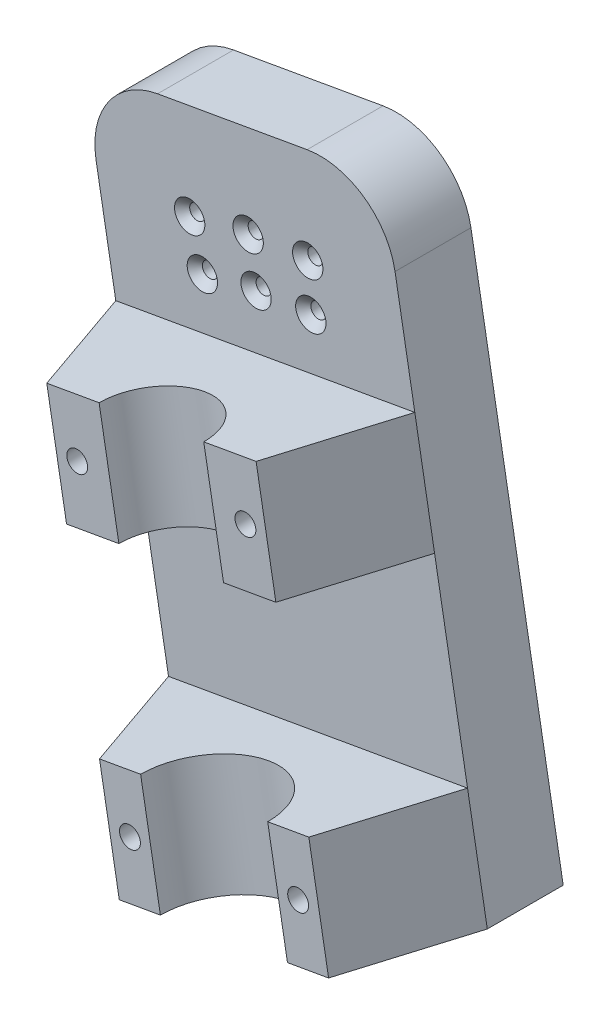
ISO-10303-21;
HEADER;
FILE_DESCRIPTION(('STEP AP214'),'2;1');
FILE_NAME('part.step','',(''),(''),'','','');
FILE_SCHEMA(('AUTOMOTIVE_DESIGN { 1 0 10303 214 1 1 1 1 }'));
ENDSEC;
DATA;
#1=APPLICATION_CONTEXT('core data for automotive mechanical design processes');
#2=APPLICATION_PROTOCOL_DEFINITION('international standard','automotive_design',2000,#1);
#3=PRODUCT_CONTEXT('',#1,'mechanical');
#4=PRODUCT('Part','Part','',(#3));
#5=PRODUCT_RELATED_PRODUCT_CATEGORY('part','',(#4));
#6=PRODUCT_DEFINITION_FORMATION('','',#4);
#7=PRODUCT_DEFINITION_CONTEXT('part definition',#1,'design');
#8=PRODUCT_DEFINITION('design','',#6,#7);
#9=PRODUCT_DEFINITION_SHAPE('','',#8);
#10=(LENGTH_UNIT() NAMED_UNIT(*) SI_UNIT(.MILLI.,.METRE.));
#11=(NAMED_UNIT(*) PLANE_ANGLE_UNIT() SI_UNIT($,.RADIAN.));
#12=(NAMED_UNIT(*) SI_UNIT($,.STERADIAN.) SOLID_ANGLE_UNIT());
#13=UNCERTAINTY_MEASURE_WITH_UNIT(LENGTH_MEASURE(1.E-05),#10,'distance_accuracy_value','');
#14=(GEOMETRIC_REPRESENTATION_CONTEXT(3) GLOBAL_UNCERTAINTY_ASSIGNED_CONTEXT((#13)) GLOBAL_UNIT_ASSIGNED_CONTEXT((#10,
#11,#12)) REPRESENTATION_CONTEXT('',''));
#15=CARTESIAN_POINT('',(0.,0.,0.));
#16=DIRECTION('',(0.,0.,1.));
#17=DIRECTION('',(1.,0.,0.));
#18=AXIS2_PLACEMENT_3D('',#15,#16,#17);
#19=CARTESIAN_POINT('',(-10.5925388376752,60.073272933746,40.));
#20=DIRECTION('',(-0.173648177666807,0.98480775301223,0.));
#21=DIRECTION('',(-0.98480775301223,-0.173648177666807,0.));
#22=AXIS2_PLACEMENT_3D('',#19,#20,#21);
#23=PLANE('',#22);
#24=DIRECTION('',(0.365748417469977,0.064491314151333,0.928476690885259));
#25=VECTOR('',#24,1.);
#26=CARTESIAN_POINT('',(-17.3843164446646,58.8756992946631,42.7586206896586));
#27=LINE('',#26,#25);
#28=CARTESIAN_POINT('',(-30.2886938979296,56.6003093804081,10.));
#29=VERTEX_POINT('',#28);
#30=CARTESIAN_POINT('',(-24.3798473798555,57.6421984464089,25.));
#31=VERTEX_POINT('',#30);
#32=EDGE_CURVE('E461',#29,#31,#27,.T.);
#33=ORIENTED_EDGE('',*,*,#32,.T.);
#34=DIRECTION('',(0.984807753012227,0.173648177666823,0.));
#35=VECTOR('',#34,1.);
#36=CARTESIAN_POINT('',(-10.5925388376762,60.0732729337458,25.));
#37=LINE('',#36,#35);
#38=CARTESIAN_POINT('',(-17.4861931087608,58.8577356900783,25.));
#39=VERTEX_POINT('',#38);
#40=EDGE_CURVE('E513',#31,#39,#37,.T.);
#41=ORIENTED_EDGE('',*,*,#40,.T.);
#42=CARTESIAN_POINT('',(-10.5925388376752,60.073272933746,25.));
#43=DIRECTION('',(-0.173648177666823,0.984807753012227,0.));
#44=DIRECTION('',(-0.984807753012227,-0.173648177666823,0.));
#45=AXIS2_PLACEMENT_3D('',#42,#43,#44);
#46=CIRCLE('',#45,7.);
#47=CARTESIAN_POINT('',(-3.69888456658963,61.2888101774138,25.));
#48=VERTEX_POINT('',#47);
#49=EDGE_CURVE('E182',#48,#39,#46,.T.);
#50=ORIENTED_EDGE('',*,*,#49,.F.);
#51=DIRECTION('',(0.984807753012227,0.173648177666823,0.));
#52=VECTOR('',#51,1.);
#53=CARTESIAN_POINT('',(-10.5925388376762,60.0732729337458,25.));
#54=LINE('',#53,#52);
#55=CARTESIAN_POINT('',(3.1947697045051,62.5043474210832,25.));
#56=VERTEX_POINT('',#55);
#57=EDGE_CURVE('E164',#48,#56,#54,.T.);
#58=ORIENTED_EDGE('',*,*,#57,.T.);
#59=DIRECTION('',(-0.365748417469,-0.0644913141511606,0.928476690885656));
#60=VECTOR('',#59,1.);
#61=CARTESIAN_POINT('',(-3.8007612306654,61.2708465728325,42.7586206896584));
#62=LINE('',#61,#60);
#63=CARTESIAN_POINT('',(9.10361622255956,63.5462364870804,10.));
#64=VERTEX_POINT('',#63);
#65=EDGE_CURVE('E178',#64,#56,#62,.T.);
#66=ORIENTED_EDGE('',*,*,#65,.F.);
#67=DIRECTION('',(0.98480775301223,0.173648177666807,0.));
#68=VECTOR('',#67,1.);
#69=CARTESIAN_POINT('',(-10.5925388376752,60.073272933746,10.));
#70=LINE('',#69,#68);
#71=EDGE_CURVE('E201',#29,#64,#70,.T.);
#72=ORIENTED_EDGE('',*,*,#71,.F.);
#73=EDGE_LOOP('',(#33,#41,#50,#58,#66,#72));
#74=FACE_BOUND('',#73,.T.);
#75=ADVANCED_FACE('F39',(#74),#23,.T.);
#76=CARTESIAN_POINT('',(-7.98781617267313,45.3011566385626,40.));
#77=DIRECTION('',(-0.173648177666807,0.98480775301223,0.));
#78=DIRECTION('',(-0.98480775301223,-0.173648177666807,0.));
#79=AXIS2_PLACEMENT_3D('',#76,#77,#78);
#80=PLANE('',#79);
#81=DIRECTION('',(0.98480775301223,0.173648177666807,0.));
#82=VECTOR('',#81,1.);
#83=CARTESIAN_POINT('',(-7.98781617267313,45.3011566385626,25.));
#84=LINE('',#83,#82);
#85=CARTESIAN_POINT('',(-21.7751247148532,42.8700821512257,25.));
#86=VERTEX_POINT('',#85);
#87=CARTESIAN_POINT('',(-14.8814704437585,44.0856193948949,25.));
#88=VERTEX_POINT('',#87);
#89=EDGE_CURVE('E467',#86,#88,#84,.T.);
#90=ORIENTED_EDGE('',*,*,#89,.F.);
#91=DIRECTION('',(0.365748417469977,0.0644913141513331,0.92847669088526));
#92=VECTOR('',#91,1.);
#93=CARTESIAN_POINT('',(-14.7795937796623,44.1035829994797,42.7586206896585));
#94=LINE('',#93,#92);
#95=CARTESIAN_POINT('',(-27.6839712329273,41.8281930852247,10.));
#96=VERTEX_POINT('',#95);
#97=EDGE_CURVE('E460',#96,#86,#94,.T.);
#98=ORIENTED_EDGE('',*,*,#97,.F.);
#99=DIRECTION('',(0.98480775301223,0.173648177666807,0.));
#100=VECTOR('',#99,1.);
#101=CARTESIAN_POINT('',(-7.98781617267313,45.3011566385626,10.));
#102=LINE('',#101,#100);
#103=CARTESIAN_POINT('',(11.7083388875619,48.774120191897,10.));
#104=VERTEX_POINT('',#103);
#105=EDGE_CURVE('E203',#96,#104,#102,.T.);
#106=ORIENTED_EDGE('',*,*,#105,.T.);
#107=DIRECTION('',(-0.365748417469,-0.0644913141511607,0.928476690885656));
#108=VECTOR('',#107,1.);
#109=CARTESIAN_POINT('',(-1.19603856566308,46.4987302776491,42.7586206896585));
#110=LINE('',#109,#108);
#111=CARTESIAN_POINT('',(5.79949236950684,47.7322311258994,25.));
#112=VERTEX_POINT('',#111);
#113=EDGE_CURVE('E190',#104,#112,#110,.T.);
#114=ORIENTED_EDGE('',*,*,#113,.T.);
#115=DIRECTION('',(0.98480775301223,0.173648177666807,0.));
#116=VECTOR('',#115,1.);
#117=CARTESIAN_POINT('',(-7.98781617267313,45.3011566385626,25.));
#118=LINE('',#117,#116);
#119=CARTESIAN_POINT('',(-1.09416190158726,46.5166938822302,25.));
#120=VERTEX_POINT('',#119);
#121=EDGE_CURVE('E167',#120,#112,#118,.T.);
#122=ORIENTED_EDGE('',*,*,#121,.F.);
#123=CARTESIAN_POINT('',(-7.98781617267287,45.3011566385626,25.));
#124=DIRECTION('',(-0.173648177666807,0.98480775301223,0.));
#125=DIRECTION('',(-0.98480775301223,-0.173648177666807,0.));
#126=AXIS2_PLACEMENT_3D('',#123,#124,#125);
#127=CIRCLE('',#126,7.);
#128=EDGE_CURVE('E291',#120,#88,#127,.T.);
#129=ORIENTED_EDGE('',*,*,#128,.T.);
#130=EDGE_LOOP('',(#90,#98,#106,#114,#122,#129));
#131=FACE_BOUND('',#130,.T.);
#132=ADVANCED_FACE('F338',(#131),#80,.F.);
#133=CARTESIAN_POINT('',(-20.7380441262546,2.4358829647356,10.));
#134=DIRECTION('',(-0.173648177666807,0.98480775301223,0.));
#135=DIRECTION('',(-0.98480775301223,-0.173648177666807,0.));
#136=AXIS2_PLACEMENT_3D('',#133,#134,#135);
#137=PLANE('',#136);
#138=DIRECTION('',(0.98480775301223,0.173648177666807,0.));
#139=VECTOR('',#138,1.);
#140=CARTESIAN_POINT('',(-20.7380441262546,2.4358829647356,25.));
#141=LINE('',#140,#139);
#142=CARTESIAN_POINT('',(7.32897683460336,7.38485602824126,25.));
#143=VERTEX_POINT('',#142);
#144=CARTESIAN_POINT('',(12.7454194761798,8.33992100541031,25.));
#145=VERTEX_POINT('',#144);
#146=EDGE_CURVE('E494',#143,#145,#141,.T.);
#147=ORIENTED_EDGE('',*,*,#146,.F.);
#148=CARTESIAN_POINT('',(-1.04188906600059,5.9088465180734,25.));
#149=DIRECTION('',(-0.173648177666807,0.98480775301223,0.));
#150=DIRECTION('',(-0.98480775301223,-0.173648177666807,0.));
#151=AXIS2_PLACEMENT_3D('',#148,#149,#150);
#152=CIRCLE('',#151,8.5);
#153=CARTESIAN_POINT('',(-9.41275496660455,4.43283700790554,25.));
#154=VERTEX_POINT('',#153);
#155=EDGE_CURVE('E491',#143,#154,#152,.T.);
#156=ORIENTED_EDGE('',*,*,#155,.T.);
#157=DIRECTION('',(-0.98480775301223,-0.173648177666807,0.));
#158=VECTOR('',#157,1.);
#159=CARTESIAN_POINT('',(-20.7380441262546,2.4358829647356,25.));
#160=LINE('',#159,#158);
#161=CARTESIAN_POINT('',(-14.8291976081809,3.47777203073643,25.));
#162=VERTEX_POINT('',#161);
#163=EDGE_CURVE('E490',#154,#162,#160,.T.);
#164=ORIENTED_EDGE('',*,*,#163,.T.);
#165=DIRECTION('',(0.365748417469977,0.064491314151333,0.92847669088526));
#166=VECTOR('',#165,1.);
#167=CARTESIAN_POINT('',(-20.7380441262546,2.4358829647356,10.));
#168=LINE('',#167,#166);
#169=CARTESIAN_POINT('',(-20.7380441262544,2.43588296473565,10.));
#170=VERTEX_POINT('',#169);
#171=EDGE_CURVE('E195',#170,#162,#168,.T.);
#172=ORIENTED_EDGE('',*,*,#171,.F.);
#173=DIRECTION('',(0.,0.,-1.));
#174=VECTOR('',#173,1.);
#175=CARTESIAN_POINT('',(-20.7380441262546,2.4358829647356,10.));
#176=LINE('',#175,#174);
#177=CARTESIAN_POINT('',(-20.7380441262546,2.4358829647356,0.));
#178=VERTEX_POINT('',#177);
#179=EDGE_CURVE('E244',#170,#178,#176,.T.);
#180=ORIENTED_EDGE('',*,*,#179,.T.);
#181=DIRECTION('',(0.98480775301223,0.173648177666807,0.));
#182=VECTOR('',#181,1.);
#183=CARTESIAN_POINT('',(-20.7380441262546,2.4358829647356,0.));
#184=LINE('',#183,#182);
#185=CARTESIAN_POINT('',(18.6542659942346,9.38181007140788,0.));
#186=VERTEX_POINT('',#185);
#187=EDGE_CURVE('E240',#178,#186,#184,.T.);
#188=ORIENTED_EDGE('',*,*,#187,.T.);
#189=DIRECTION('',(0.,0.,-1.));
#190=VECTOR('',#189,1.);
#191=CARTESIAN_POINT('',(18.6542659942346,9.38181007140788,10.));
#192=LINE('',#191,#190);
#193=CARTESIAN_POINT('',(18.6542659942348,9.38181007140792,10.));
#194=VERTEX_POINT('',#193);
#195=EDGE_CURVE('E235',#194,#186,#192,.T.);
#196=ORIENTED_EDGE('',*,*,#195,.F.);
#197=DIRECTION('',(-0.365748417469,-0.0644913141511606,0.928476690885656));
#198=VECTOR('',#197,1.);
#199=CARTESIAN_POINT('',(13.2208439086791,8.42375116014789,23.793103448245));
#200=LINE('',#199,#198);
#201=EDGE_CURVE('E189',#194,#145,#200,.T.);
#202=ORIENTED_EDGE('',*,*,#201,.T.);
#203=EDGE_LOOP('',(#147,#156,#164,#172,#180,#188,#196,#202));
#204=FACE_BOUND('',#203,.T.);
#205=ADVANCED_FACE('F322',(#204),#137,.F.);
#206=CARTESIAN_POINT('',(-3.64661173100294,20.6809628132568,40.));
#207=DIRECTION('',(-0.173648177666807,0.98480775301223,0.));
#208=DIRECTION('',(-0.98480775301223,-0.173648177666807,0.));
#209=AXIS2_PLACEMENT_3D('',#206,#207,#208);
#210=PLANE('',#209);
#211=CARTESIAN_POINT('',(-3.64661173100294,20.6809628132568,25.));
#212=DIRECTION('',(-0.173648177666823,0.984807753012227,0.));
#213=DIRECTION('',(-0.984807753012227,-0.173648177666823,0.));
#214=AXIS2_PLACEMENT_3D('',#211,#212,#213);
#215=CIRCLE('',#214,8.5);
#216=CARTESIAN_POINT('',(4.72425416960098,22.1569723234248,25.));
#217=VERTEX_POINT('',#216);
#218=CARTESIAN_POINT('',(-12.0174776316069,19.2049533030888,25.));
#219=VERTEX_POINT('',#218);
#220=EDGE_CURVE('E505',#217,#219,#215,.T.);
#221=ORIENTED_EDGE('',*,*,#220,.F.);
#222=DIRECTION('',(0.984807753012227,0.173648177666823,0.));
#223=VECTOR('',#222,1.);
#224=CARTESIAN_POINT('',(-3.64661173100329,20.6809628132568,25.));
#225=LINE('',#224,#223);
#226=CARTESIAN_POINT('',(10.1406968111774,23.112037300594,25.));
#227=VERTEX_POINT('',#226);
#228=EDGE_CURVE('E481',#217,#227,#225,.T.);
#229=ORIENTED_EDGE('',*,*,#228,.T.);
#230=DIRECTION('',(-0.365748417469,-0.0644913141511606,0.928476690885656));
#231=VECTOR('',#230,1.);
#232=CARTESIAN_POINT('',(3.14516587600745,21.8785364523434,42.7586206896586));
#233=LINE('',#232,#231);
#234=CARTESIAN_POINT('',(16.0495433292325,24.1539263665913,10.));
#235=VERTEX_POINT('',#234);
#236=EDGE_CURVE('E288',#235,#227,#233,.T.);
#237=ORIENTED_EDGE('',*,*,#236,.F.);
#238=DIRECTION('',(0.98480775301223,0.173648177666807,0.));
#239=VECTOR('',#238,1.);
#240=CARTESIAN_POINT('',(-3.64661173100294,20.6809628132568,10.));
#241=LINE('',#240,#239);
#242=CARTESIAN_POINT('',(-23.3427667912567,17.2079992599191,10.));
#243=VERTEX_POINT('',#242);
#244=EDGE_CURVE('E193',#243,#235,#241,.T.);
#245=ORIENTED_EDGE('',*,*,#244,.F.);
#246=DIRECTION('',(0.365748417469977,0.064491314151333,0.928476690885259));
#247=VECTOR('',#246,1.);
#248=CARTESIAN_POINT('',(-10.4383893379917,19.483389174174,42.7586206896584));
#249=LINE('',#248,#247);
#250=CARTESIAN_POINT('',(-17.4339202731833,18.2498883259197,25.));
#251=VERTEX_POINT('',#250);
#252=EDGE_CURVE('E285',#243,#251,#249,.T.);
#253=ORIENTED_EDGE('',*,*,#252,.T.);
#254=DIRECTION('',(-0.984807753012227,-0.173648177666823,0.));
#255=VECTOR('',#254,1.);
#256=CARTESIAN_POINT('',(-3.64661173100329,20.6809628132568,25.));
#257=LINE('',#256,#255);
#258=EDGE_CURVE('E503',#219,#251,#257,.T.);
#259=ORIENTED_EDGE('',*,*,#258,.F.);
#260=EDGE_LOOP('',(#221,#229,#237,#245,#253,#259));
#261=FACE_BOUND('',#260,.T.);
#262=ADVANCED_FACE('F381',(#261),#210,.T.);
#263=CARTESIAN_POINT('',(-34.6298983395991,81.220503205714,10.));
#264=DIRECTION('',(0.98480775301223,0.173648177666807,0.));
#265=DIRECTION('',(-0.173648177666807,0.98480775301223,0.));
#266=AXIS2_PLACEMENT_3D('',#263,#264,#265);
#267=PLANE('',#266);
#268=DIRECTION('',(0.173648177666807,-0.98480775301223,0.));
#269=VECTOR('',#268,1.);
#270=CARTESIAN_POINT('',(-34.6298983395991,81.220503205714,10.));
#271=LINE('',#270,#269);
#272=CARTESIAN_POINT('',(-32.8934165629311,71.3724256755917,10.));
#273=VERTEX_POINT('',#272);
#274=EDGE_CURVE('E233',#273,#29,#271,.T.);
#275=ORIENTED_EDGE('',*,*,#274,.F.);
#276=DIRECTION('',(0.,0.,-1.));
#277=VECTOR('',#276,1.);
#278=CARTESIAN_POINT('',(-32.8934165629311,71.3724256755917,0.));
#279=LINE('',#278,#277);
#280=CARTESIAN_POINT('',(-32.8934165629311,71.3724256755917,0.));
#281=VERTEX_POINT('',#280);
#282=EDGE_CURVE('E11',#273,#281,#279,.T.);
#283=ORIENTED_EDGE('',*,*,#282,.T.);
#284=DIRECTION('',(0.173648177666807,-0.98480775301223,0.));
#285=VECTOR('',#284,1.);
#286=CARTESIAN_POINT('',(-34.6298983395991,81.220503205714,0.));
#287=LINE('',#286,#285);
#288=EDGE_CURVE('E229',#281,#178,#287,.T.);
#289=ORIENTED_EDGE('',*,*,#288,.T.);
#290=ORIENTED_EDGE('',*,*,#179,.F.);
#291=DIRECTION('',(-0.173648177666823,0.984807753012227,0.));
#292=VECTOR('',#291,1.);
#293=CARTESIAN_POINT('',(-16.5704878622505,-21.1995031075581,10.));
#294=LINE('',#293,#292);
#295=EDGE_CURVE('E463',#170,#243,#294,.T.);
#296=ORIENTED_EDGE('',*,*,#295,.T.);
#297=EDGE_CURVE('E232',#96,#243,#271,.T.);
#298=ORIENTED_EDGE('',*,*,#297,.F.);
#299=EDGE_CURVE('E457',#96,#29,#294,.T.);
#300=ORIENTED_EDGE('',*,*,#299,.T.);
#301=EDGE_LOOP('',(#275,#283,#289,#290,#296,#298,#300));
#302=FACE_BOUND('',#301,.T.);
#303=ADVANCED_FACE('F327',(#302),#267,.F.);
#304=CARTESIAN_POINT('',(0.,0.,10.));
#305=DIRECTION('',(0.,0.,-1.));
#306=DIRECTION('',(-1.,0.,0.));
#307=AXIS2_PLACEMENT_3D('',#304,#305,#306);
#308=PLANE('',#307);
#309=ORIENTED_EDGE('',*,*,#297,.T.);
#310=ORIENTED_EDGE('',*,*,#244,.T.);
#311=DIRECTION('',(0.173648177666807,-0.98480775301223,0.));
#312=VECTOR('',#311,1.);
#313=CARTESIAN_POINT('',(4.76241178089006,88.1664303123863,10.));
#314=LINE('',#313,#312);
#315=EDGE_CURVE('E228',#104,#235,#314,.T.);
#316=ORIENTED_EDGE('',*,*,#315,.F.);
#317=ORIENTED_EDGE('',*,*,#105,.F.);
#318=EDGE_LOOP('',(#309,#310,#316,#317));
#319=FACE_BOUND('',#318,.T.);
#320=ADVANCED_FACE('F375',(#319),#308,.F.);
#321=CARTESIAN_POINT('',(-34.6298983395991,81.220503205714,10.));
#322=DIRECTION('',(-0.173648177666807,0.98480775301223,0.));
#323=DIRECTION('',(-0.98480775301223,-0.173648177666807,0.));
#324=AXIS2_PLACEMENT_3D('',#321,#322,#323);
#325=PLANE('',#324);
#326=DIRECTION('',(0.98480775301223,0.173648177666807,0.));
#327=VECTOR('',#326,1.);
#328=CARTESIAN_POINT('',(-34.6298983395991,81.220503205714,10.));
#329=LINE('',#328,#327);
#330=CARTESIAN_POINT('',(-24.7818208094768,82.9569849823821,10.));
#331=VERTEX_POINT('',#330);
#332=CARTESIAN_POINT('',(-5.08566574923224,86.4299485357182,10.));
#333=VERTEX_POINT('',#332);
#334=EDGE_CURVE('E225',#331,#333,#329,.T.);
#335=ORIENTED_EDGE('',*,*,#334,.T.);
#336=DIRECTION('',(0.,0.,-1.));
#337=VECTOR('',#336,1.);
#338=CARTESIAN_POINT('',(-5.08566574923224,86.4299485357182,10.));
#339=LINE('',#338,#337);
#340=CARTESIAN_POINT('',(-5.08566574923224,86.4299485357182,0.));
#341=VERTEX_POINT('',#340);
#342=EDGE_CURVE('E296',#333,#341,#339,.T.);
#343=ORIENTED_EDGE('',*,*,#342,.T.);
#344=DIRECTION('',(0.98480775301223,0.173648177666807,0.));
#345=VECTOR('',#344,1.);
#346=CARTESIAN_POINT('',(-34.6298983395991,81.220503205714,0.));
#347=LINE('',#346,#345);
#348=CARTESIAN_POINT('',(-24.7818208094768,82.9569849823821,0.));
#349=VERTEX_POINT('',#348);
#350=EDGE_CURVE('E224',#349,#341,#347,.T.);
#351=ORIENTED_EDGE('',*,*,#350,.F.);
#352=DIRECTION('',(0.,0.,-1.));
#353=VECTOR('',#352,1.);
#354=CARTESIAN_POINT('',(-24.7818208094768,82.9569849823821,10.));
#355=LINE('',#354,#353);
#356=EDGE_CURVE('E294',#349,#331,#355,.F.);
#357=ORIENTED_EDGE('',*,*,#356,.T.);
#358=EDGE_LOOP('',(#335,#343,#351,#357));
#359=FACE_BOUND('',#358,.T.);
#360=ADVANCED_FACE('F309',(#359),#325,.T.);
#361=CARTESIAN_POINT('',(4.76241178089006,88.1664303123863,10.));
#362=DIRECTION('',(0.98480775301223,0.173648177666807,0.));
#363=DIRECTION('',(-0.173648177666807,0.98480775301223,0.));
#364=AXIS2_PLACEMENT_3D('',#361,#362,#363);
#365=PLANE('',#364);
#366=DIRECTION('',(0.173648177666807,-0.98480775301223,0.));
#367=VECTOR('',#366,1.);
#368=CARTESIAN_POINT('',(4.76241178089006,88.1664303123863,0.));
#369=LINE('',#368,#367);
#370=CARTESIAN_POINT('',(6.49889355755812,78.318352782264,0.));
#371=VERTEX_POINT('',#370);
#372=EDGE_CURVE('E238',#371,#186,#369,.T.);
#373=ORIENTED_EDGE('',*,*,#372,.F.);
#374=DIRECTION('',(0.,0.,-1.));
#375=VECTOR('',#374,1.);
#376=CARTESIAN_POINT('',(6.49889355755812,78.318352782264,10.));
#377=LINE('',#376,#375);
#378=CARTESIAN_POINT('',(6.49889355755812,78.318352782264,10.));
#379=VERTEX_POINT('',#378);
#380=EDGE_CURVE('E62',#371,#379,#377,.F.);
#381=ORIENTED_EDGE('',*,*,#380,.T.);
#382=EDGE_CURVE('E230',#379,#64,#314,.T.);
#383=ORIENTED_EDGE('',*,*,#382,.T.);
#384=DIRECTION('',(0.173648177666823,-0.984807753012227,0.));
#385=VECTOR('',#384,1.);
#386=CARTESIAN_POINT('',(8.75631986722586,65.5158519931052,10.));
#387=LINE('',#386,#385);
#388=EDGE_CURVE('E188',#64,#104,#387,.T.);
#389=ORIENTED_EDGE('',*,*,#388,.T.);
#390=ORIENTED_EDGE('',*,*,#315,.T.);
#391=EDGE_CURVE('E171',#235,#194,#387,.T.);
#392=ORIENTED_EDGE('',*,*,#391,.T.);
#393=ORIENTED_EDGE('',*,*,#195,.T.);
#394=EDGE_LOOP('',(#373,#381,#383,#389,#390,#392,#393));
#395=FACE_BOUND('',#394,.T.);
#396=ADVANCED_FACE('F316',(#395),#365,.T.);
#397=CARTESIAN_POINT('',(-11.8080760813513,66.9669272048301,10.));
#398=DIRECTION('',(0.,0.,-1.));
#399=DIRECTION('',(-1.,0.,0.));
#400=AXIS2_PLACEMENT_3D('',#397,#398,#399);
#401=CIRCLE('',#400,2.);
#402=CARTESIAN_POINT('',(-13.8080760813513,66.9669272048301,10.));
#403=VERTEX_POINT('',#402);
#404=EDGE_CURVE('E267',#403,#403,#401,.T.);
#405=ORIENTED_EDGE('',*,*,#404,.T.);
#406=EDGE_LOOP('',(#405));
#407=FACE_BOUND('',#406,.T.);
#408=CARTESIAN_POINT('',(-12.8499651473529,72.8757737229034,10.));
#409=DIRECTION('',(0.,0.,-1.));
#410=DIRECTION('',(-1.,0.,0.));
#411=AXIS2_PLACEMENT_3D('',#408,#409,#410);
#412=CIRCLE('',#411,2.);
#413=CARTESIAN_POINT('',(-14.8499651473529,72.8757737229034,10.));
#414=VERTEX_POINT('',#413);
#415=EDGE_CURVE('E264',#414,#414,#412,.T.);
#416=ORIENTED_EDGE('',*,*,#415,.T.);
#417=EDGE_LOOP('',(#416));
#418=FACE_BOUND('',#417,.T.);
#419=CARTESIAN_POINT('',(-18.8867130572049,65.32451354503,10.));
#420=DIRECTION('',(0.,0.,-1.));
#421=DIRECTION('',(-1.,0.,0.));
#422=AXIS2_PLACEMENT_3D('',#419,#420,#421);
#423=CIRCLE('',#422,2.);
#424=CARTESIAN_POINT('',(-20.8867130572049,65.32451354503,10.));
#425=VERTEX_POINT('',#424);
#426=EDGE_CURVE('E261',#425,#425,#423,.T.);
#427=ORIENTED_EDGE('',*,*,#426,.T.);
#428=EDGE_LOOP('',(#427));
#429=FACE_BOUND('',#428,.T.);
#430=CARTESIAN_POINT('',(-4.5945945945946,67.8445996414698,10.));
#431=DIRECTION('',(0.,0.,-1.));
#432=DIRECTION('',(-1.,0.,0.));
#433=AXIS2_PLACEMENT_3D('',#430,#431,#432);
#434=CIRCLE('',#433,2.);
#435=CARTESIAN_POINT('',(-6.59459459459461,67.8445996414698,10.));
#436=VERTEX_POINT('',#435);
#437=EDGE_CURVE('E258',#436,#436,#434,.T.);
#438=ORIENTED_EDGE('',*,*,#437,.T.);
#439=EDGE_LOOP('',(#438));
#440=FACE_BOUND('',#439,.T.);
#441=CARTESIAN_POINT('',(-5.,73.8308878451289,10.));
#442=DIRECTION('',(0.,0.,-1.));
#443=DIRECTION('',(-1.,0.,0.));
#444=AXIS2_PLACEMENT_3D('',#441,#442,#443);
#445=CIRCLE('',#444,2.);
#446=CARTESIAN_POINT('',(-7.,73.8308878451289,10.));
#447=VERTEX_POINT('',#446);
#448=EDGE_CURVE('E255',#447,#447,#445,.T.);
#449=ORIENTED_EDGE('',*,*,#448,.T.);
#450=EDGE_LOOP('',(#449));
#451=FACE_BOUND('',#450,.T.);
#452=CARTESIAN_POINT('',(-20.5531877387229,71.0884412107679,10.));
#453=DIRECTION('',(0.,0.,-1.));
#454=DIRECTION('',(-1.,0.,0.));
#455=AXIS2_PLACEMENT_3D('',#452,#453,#454);
#456=CIRCLE('',#455,2.);
#457=CARTESIAN_POINT('',(-22.5531877387229,71.0884412107679,10.));
#458=VERTEX_POINT('',#457);
#459=EDGE_CURVE('E252',#458,#458,#456,.T.);
#460=ORIENTED_EDGE('',*,*,#459,.T.);
#461=EDGE_LOOP('',(#460));
#462=FACE_BOUND('',#461,.T.);
#463=ORIENTED_EDGE('',*,*,#382,.F.);
#464=CARTESIAN_POINT('',(-3.34918397256417,76.5818710055959,10.));
#465=DIRECTION('',(0.,0.,-1.));
#466=DIRECTION('',(-1.,0.,0.));
#467=AXIS2_PLACEMENT_3D('',#464,#465,#466);
#468=CIRCLE('',#467,10.);
#469=EDGE_CURVE('E47',#379,#333,#468,.F.);
#470=ORIENTED_EDGE('',*,*,#469,.T.);
#471=ORIENTED_EDGE('',*,*,#334,.F.);
#472=CARTESIAN_POINT('',(-23.0453390328088,73.1089074522598,10.));
#473=DIRECTION('',(0.,0.,-1.));
#474=DIRECTION('',(-1.,0.,0.));
#475=AXIS2_PLACEMENT_3D('',#472,#473,#474);
#476=CIRCLE('',#475,10.);
#477=EDGE_CURVE('E54',#331,#273,#476,.F.);
#478=ORIENTED_EDGE('',*,*,#477,.T.);
#479=ORIENTED_EDGE('',*,*,#274,.T.);
#480=ORIENTED_EDGE('',*,*,#71,.T.);
#481=EDGE_LOOP('',(#463,#470,#471,#478,#479,#480));
#482=FACE_BOUND('',#481,.T.);
#483=ADVANCED_FACE('F305',(#407,#418,#429,#440,#451,#462,#482),#308,.F.);
#484=CARTESIAN_POINT('',(0.,0.,0.));
#485=DIRECTION('',(0.,0.,-1.));
#486=DIRECTION('',(-1.,0.,0.));
#487=AXIS2_PLACEMENT_3D('',#484,#485,#486);
#488=PLANE('',#487);
#489=CARTESIAN_POINT('',(-5.,73.8308878451289,0.));
#490=DIRECTION('',(0.,0.,1.));
#491=DIRECTION('',(1.,0.,0.));
#492=AXIS2_PLACEMENT_3D('',#489,#490,#491);
#493=CIRCLE('',#492,1.);
#494=CARTESIAN_POINT('',(-4.,73.8308878451289,0.));
#495=VERTEX_POINT('',#494);
#496=EDGE_CURVE('E210',#495,#495,#493,.T.);
#497=ORIENTED_EDGE('',*,*,#496,.T.);
#498=EDGE_LOOP('',(#497));
#499=FACE_BOUND('',#498,.T.);
#500=CARTESIAN_POINT('',(-4.5945945945946,67.8445996414698,0.));
#501=DIRECTION('',(0.,0.,1.));
#502=DIRECTION('',(1.,0.,0.));
#503=AXIS2_PLACEMENT_3D('',#500,#501,#502);
#504=CIRCLE('',#503,1.);
#505=CARTESIAN_POINT('',(-3.5945945945946,67.8445996414698,0.));
#506=VERTEX_POINT('',#505);
#507=EDGE_CURVE('E214',#506,#506,#504,.T.);
#508=ORIENTED_EDGE('',*,*,#507,.T.);
#509=EDGE_LOOP('',(#508));
#510=FACE_BOUND('',#509,.T.);
#511=CARTESIAN_POINT('',(-18.8867130572049,65.32451354503,0.));
#512=DIRECTION('',(0.,0.,1.));
#513=DIRECTION('',(1.,0.,0.));
#514=AXIS2_PLACEMENT_3D('',#511,#512,#513);
#515=CIRCLE('',#514,1.);
#516=CARTESIAN_POINT('',(-17.8867130572049,65.32451354503,0.));
#517=VERTEX_POINT('',#516);
#518=EDGE_CURVE('E217',#517,#517,#515,.T.);
#519=ORIENTED_EDGE('',*,*,#518,.T.);
#520=EDGE_LOOP('',(#519));
#521=FACE_BOUND('',#520,.T.);
#522=CARTESIAN_POINT('',(-12.8499651473529,72.8757737229034,0.));
#523=DIRECTION('',(0.,0.,1.));
#524=DIRECTION('',(1.,0.,0.));
#525=AXIS2_PLACEMENT_3D('',#522,#523,#524);
#526=CIRCLE('',#525,1.);
#527=CARTESIAN_POINT('',(-11.8499651473529,72.8757737229034,0.));
#528=VERTEX_POINT('',#527);
#529=EDGE_CURVE('E209',#528,#528,#526,.T.);
#530=ORIENTED_EDGE('',*,*,#529,.T.);
#531=EDGE_LOOP('',(#530));
#532=FACE_BOUND('',#531,.T.);
#533=CARTESIAN_POINT('',(-11.8080760813513,66.9669272048301,0.));
#534=DIRECTION('',(0.,0.,1.));
#535=DIRECTION('',(1.,0.,0.));
#536=AXIS2_PLACEMENT_3D('',#533,#534,#535);
#537=CIRCLE('',#536,1.);
#538=CARTESIAN_POINT('',(-10.8080760813513,66.9669272048301,0.));
#539=VERTEX_POINT('',#538);
#540=EDGE_CURVE('E206',#539,#539,#537,.T.);
#541=ORIENTED_EDGE('',*,*,#540,.T.);
#542=EDGE_LOOP('',(#541));
#543=FACE_BOUND('',#542,.T.);
#544=CARTESIAN_POINT('',(-20.5531877387229,71.0884412107679,0.));
#545=DIRECTION('',(0.,0.,1.));
#546=DIRECTION('',(1.,0.,0.));
#547=AXIS2_PLACEMENT_3D('',#544,#545,#546);
#548=CIRCLE('',#547,1.);
#549=CARTESIAN_POINT('',(-19.5531877387229,71.0884412107679,0.));
#550=VERTEX_POINT('',#549);
#551=EDGE_CURVE('E213',#550,#550,#548,.T.);
#552=ORIENTED_EDGE('',*,*,#551,.T.);
#553=EDGE_LOOP('',(#552));
#554=FACE_BOUND('',#553,.T.);
#555=ORIENTED_EDGE('',*,*,#350,.T.);
#556=CARTESIAN_POINT('',(-3.34918397256417,76.5818710055959,0.));
#557=DIRECTION('',(0.,0.,-1.));
#558=DIRECTION('',(-1.,0.,0.));
#559=AXIS2_PLACEMENT_3D('',#556,#557,#558);
#560=CIRCLE('',#559,10.);
#561=EDGE_CURVE('E301',#341,#371,#560,.T.);
#562=ORIENTED_EDGE('',*,*,#561,.T.);
#563=ORIENTED_EDGE('',*,*,#372,.T.);
#564=ORIENTED_EDGE('',*,*,#187,.F.);
#565=ORIENTED_EDGE('',*,*,#288,.F.);
#566=CARTESIAN_POINT('',(-23.0453390328088,73.1089074522598,0.));
#567=DIRECTION('',(0.,0.,-1.));
#568=DIRECTION('',(-1.,0.,0.));
#569=AXIS2_PLACEMENT_3D('',#566,#567,#568);
#570=CIRCLE('',#569,10.);
#571=EDGE_CURVE('E299',#281,#349,#570,.T.);
#572=ORIENTED_EDGE('',*,*,#571,.T.);
#573=EDGE_LOOP('',(#555,#562,#563,#564,#565,#572));
#574=FACE_BOUND('',#573,.T.);
#575=ADVANCED_FACE('F314',(#499,#510,#521,#532,#543,#554,#574),#488,.T.);
#576=CARTESIAN_POINT('',(-20.5531877387229,71.0884412107679,19.));
#577=DIRECTION('',(0.,0.,-1.));
#578=DIRECTION('',(-1.,0.,0.));
#579=AXIS2_PLACEMENT_3D('',#576,#577,#578);
#580=CYLINDRICAL_SURFACE('',#579,1.);
#581=CARTESIAN_POINT('',(-20.5531877387229,71.0884412107679,9.));
#582=DIRECTION('',(0.,0.,-1.));
#583=DIRECTION('',(-1.,0.,0.));
#584=AXIS2_PLACEMENT_3D('',#581,#582,#583);
#585=CIRCLE('',#584,1.);
#586=CARTESIAN_POINT('',(-21.5531877387229,71.0884412107679,9.));
#587=VERTEX_POINT('',#586);
#588=EDGE_CURVE('E282',#587,#587,#585,.F.);
#589=ORIENTED_EDGE('',*,*,#588,.T.);
#590=EDGE_LOOP('',(#589));
#591=FACE_BOUND('',#590,.T.);
#592=ORIENTED_EDGE('',*,*,#551,.F.);
#593=EDGE_LOOP('',(#592));
#594=FACE_BOUND('',#593,.T.);
#595=ADVANCED_FACE('F351',(#591,#594),#580,.F.);
#596=CARTESIAN_POINT('',(-11.8080760813513,66.9669272048301,19.));
#597=DIRECTION('',(0.,0.,-1.));
#598=DIRECTION('',(-1.,0.,0.));
#599=AXIS2_PLACEMENT_3D('',#596,#597,#598);
#600=CYLINDRICAL_SURFACE('',#599,1.);
#601=CARTESIAN_POINT('',(-11.8080760813513,66.9669272048301,9.));
#602=DIRECTION('',(0.,0.,-1.));
#603=DIRECTION('',(-1.,0.,0.));
#604=AXIS2_PLACEMENT_3D('',#601,#602,#603);
#605=CIRCLE('',#604,1.);
#606=CARTESIAN_POINT('',(-12.8080760813513,66.9669272048301,9.));
#607=VERTEX_POINT('',#606);
#608=EDGE_CURVE('E247',#607,#607,#605,.F.);
#609=ORIENTED_EDGE('',*,*,#608,.T.);
#610=EDGE_LOOP('',(#609));
#611=FACE_BOUND('',#610,.T.);
#612=ORIENTED_EDGE('',*,*,#540,.F.);
#613=EDGE_LOOP('',(#612));
#614=FACE_BOUND('',#613,.T.);
#615=ADVANCED_FACE('F347',(#611,#614),#600,.F.);
#616=CARTESIAN_POINT('',(-12.8499651473529,72.8757737229034,19.));
#617=DIRECTION('',(0.,0.,-1.));
#618=DIRECTION('',(-1.,0.,0.));
#619=AXIS2_PLACEMENT_3D('',#616,#617,#618);
#620=CYLINDRICAL_SURFACE('',#619,1.);
#621=CARTESIAN_POINT('',(-12.8499651473529,72.8757737229034,9.));
#622=DIRECTION('',(0.,0.,-1.));
#623=DIRECTION('',(-1.,0.,0.));
#624=AXIS2_PLACEMENT_3D('',#621,#622,#623);
#625=CIRCLE('',#624,1.);
#626=CARTESIAN_POINT('',(-13.8499651473529,72.8757737229034,9.));
#627=VERTEX_POINT('',#626);
#628=EDGE_CURVE('E270',#627,#627,#625,.F.);
#629=ORIENTED_EDGE('',*,*,#628,.T.);
#630=EDGE_LOOP('',(#629));
#631=FACE_BOUND('',#630,.T.);
#632=ORIENTED_EDGE('',*,*,#529,.F.);
#633=EDGE_LOOP('',(#632));
#634=FACE_BOUND('',#633,.T.);
#635=ADVANCED_FACE('F350',(#631,#634),#620,.F.);
#636=CARTESIAN_POINT('',(-18.8867130572049,65.32451354503,19.));
#637=DIRECTION('',(0.,0.,-1.));
#638=DIRECTION('',(-1.,0.,0.));
#639=AXIS2_PLACEMENT_3D('',#636,#637,#638);
#640=CYLINDRICAL_SURFACE('',#639,1.);
#641=CARTESIAN_POINT('',(-18.8867130572049,65.32451354503,9.));
#642=DIRECTION('',(0.,0.,-1.));
#643=DIRECTION('',(-1.,0.,0.));
#644=AXIS2_PLACEMENT_3D('',#641,#642,#643);
#645=CIRCLE('',#644,1.);
#646=CARTESIAN_POINT('',(-19.8867130572049,65.32451354503,9.));
#647=VERTEX_POINT('',#646);
#648=EDGE_CURVE('E273',#647,#647,#645,.F.);
#649=ORIENTED_EDGE('',*,*,#648,.T.);
#650=EDGE_LOOP('',(#649));
#651=FACE_BOUND('',#650,.T.);
#652=ORIENTED_EDGE('',*,*,#518,.F.);
#653=EDGE_LOOP('',(#652));
#654=FACE_BOUND('',#653,.T.);
#655=ADVANCED_FACE('F361',(#651,#654),#640,.F.);
#656=CARTESIAN_POINT('',(-4.5945945945946,67.8445996414698,19.));
#657=DIRECTION('',(0.,0.,-1.));
#658=DIRECTION('',(-1.,0.,0.));
#659=AXIS2_PLACEMENT_3D('',#656,#657,#658);
#660=CYLINDRICAL_SURFACE('',#659,1.);
#661=CARTESIAN_POINT('',(-4.5945945945946,67.8445996414698,9.));
#662=DIRECTION('',(0.,0.,-1.));
#663=DIRECTION('',(-1.,0.,0.));
#664=AXIS2_PLACEMENT_3D('',#661,#662,#663);
#665=CIRCLE('',#664,1.);
#666=CARTESIAN_POINT('',(-5.59459459459461,67.8445996414698,9.));
#667=VERTEX_POINT('',#666);
#668=EDGE_CURVE('E276',#667,#667,#665,.F.);
#669=ORIENTED_EDGE('',*,*,#668,.T.);
#670=EDGE_LOOP('',(#669));
#671=FACE_BOUND('',#670,.T.);
#672=ORIENTED_EDGE('',*,*,#507,.F.);
#673=EDGE_LOOP('',(#672));
#674=FACE_BOUND('',#673,.T.);
#675=ADVANCED_FACE('F357',(#671,#674),#660,.F.);
#676=CARTESIAN_POINT('',(-5.,73.8308878451289,19.));
#677=DIRECTION('',(0.,0.,-1.));
#678=DIRECTION('',(-1.,0.,0.));
#679=AXIS2_PLACEMENT_3D('',#676,#677,#678);
#680=CYLINDRICAL_SURFACE('',#679,1.);
#681=CARTESIAN_POINT('',(-5.,73.8308878451289,9.));
#682=DIRECTION('',(0.,0.,-1.));
#683=DIRECTION('',(-1.,0.,0.));
#684=AXIS2_PLACEMENT_3D('',#681,#682,#683);
#685=CIRCLE('',#684,1.);
#686=CARTESIAN_POINT('',(-6.,73.8308878451289,9.));
#687=VERTEX_POINT('',#686);
#688=EDGE_CURVE('E279',#687,#687,#685,.F.);
#689=ORIENTED_EDGE('',*,*,#688,.T.);
#690=EDGE_LOOP('',(#689));
#691=FACE_BOUND('',#690,.T.);
#692=ORIENTED_EDGE('',*,*,#496,.F.);
#693=EDGE_LOOP('',(#692));
#694=FACE_BOUND('',#693,.T.);
#695=ADVANCED_FACE('F353',(#691,#694),#680,.F.);
#696=CARTESIAN_POINT('',(-11.8080760813513,66.9669272048301,9.));
#697=DIRECTION('',(0.,0.,1.));
#698=DIRECTION('',(1.,0.,0.));
#699=AXIS2_PLACEMENT_3D('',#696,#697,#698);
#700=CONICAL_SURFACE('',#699,1.,0.785398163397446);
#701=ORIENTED_EDGE('',*,*,#404,.F.);
#702=EDGE_LOOP('',(#701));
#703=FACE_BOUND('',#702,.T.);
#704=ORIENTED_EDGE('',*,*,#608,.F.);
#705=EDGE_LOOP('',(#704));
#706=FACE_BOUND('',#705,.T.);
#707=ADVANCED_FACE('F356',(#703,#706),#700,.F.);
#708=CARTESIAN_POINT('',(-12.8499651473529,72.8757737229034,9.));
#709=DIRECTION('',(0.,0.,1.));
#710=DIRECTION('',(1.,0.,0.));
#711=AXIS2_PLACEMENT_3D('',#708,#709,#710);
#712=CONICAL_SURFACE('',#711,1.,0.785398163397446);
#713=ORIENTED_EDGE('',*,*,#415,.F.);
#714=EDGE_LOOP('',(#713));
#715=FACE_BOUND('',#714,.T.);
#716=ORIENTED_EDGE('',*,*,#628,.F.);
#717=EDGE_LOOP('',(#716));
#718=FACE_BOUND('',#717,.T.);
#719=ADVANCED_FACE('F394',(#715,#718),#712,.F.);
#720=CARTESIAN_POINT('',(-18.8867130572049,65.32451354503,9.));
#721=DIRECTION('',(0.,0.,1.));
#722=DIRECTION('',(1.,0.,0.));
#723=AXIS2_PLACEMENT_3D('',#720,#721,#722);
#724=CONICAL_SURFACE('',#723,1.,0.785398163397446);
#725=ORIENTED_EDGE('',*,*,#426,.F.);
#726=EDGE_LOOP('',(#725));
#727=FACE_BOUND('',#726,.T.);
#728=ORIENTED_EDGE('',*,*,#648,.F.);
#729=EDGE_LOOP('',(#728));
#730=FACE_BOUND('',#729,.T.);
#731=ADVANCED_FACE('F401',(#727,#730),#724,.F.);
#732=CARTESIAN_POINT('',(-4.5945945945946,67.8445996414698,9.));
#733=DIRECTION('',(0.,0.,1.));
#734=DIRECTION('',(1.,0.,0.));
#735=AXIS2_PLACEMENT_3D('',#732,#733,#734);
#736=CONICAL_SURFACE('',#735,1.,0.785398163397447);
#737=ORIENTED_EDGE('',*,*,#437,.F.);
#738=EDGE_LOOP('',(#737));
#739=FACE_BOUND('',#738,.T.);
#740=ORIENTED_EDGE('',*,*,#668,.F.);
#741=EDGE_LOOP('',(#740));
#742=FACE_BOUND('',#741,.T.);
#743=ADVANCED_FACE('F408',(#739,#742),#736,.F.);
#744=CARTESIAN_POINT('',(-5.,73.8308878451289,9.));
#745=DIRECTION('',(0.,0.,1.));
#746=DIRECTION('',(1.,0.,0.));
#747=AXIS2_PLACEMENT_3D('',#744,#745,#746);
#748=CONICAL_SURFACE('',#747,1.,0.785398163397447);
#749=ORIENTED_EDGE('',*,*,#448,.F.);
#750=EDGE_LOOP('',(#749));
#751=FACE_BOUND('',#750,.T.);
#752=ORIENTED_EDGE('',*,*,#688,.F.);
#753=EDGE_LOOP('',(#752));
#754=FACE_BOUND('',#753,.T.);
#755=ADVANCED_FACE('F415',(#751,#754),#748,.F.);
#756=CARTESIAN_POINT('',(-20.5531877387229,71.0884412107679,9.));
#757=DIRECTION('',(0.,0.,1.));
#758=DIRECTION('',(1.,0.,0.));
#759=AXIS2_PLACEMENT_3D('',#756,#757,#758);
#760=CONICAL_SURFACE('',#759,1.,0.785398163397446);
#761=ORIENTED_EDGE('',*,*,#459,.F.);
#762=EDGE_LOOP('',(#761));
#763=FACE_BOUND('',#762,.T.);
#764=ORIENTED_EDGE('',*,*,#588,.F.);
#765=EDGE_LOOP('',(#764));
#766=FACE_BOUND('',#765,.T.);
#767=ADVANCED_FACE('F422',(#763,#766),#760,.F.);
#768=CARTESIAN_POINT('',(-17.2496656229474,-21.3192604714661,8.2758620689686));
#769=DIRECTION('',(-0.91437104367494,-0.161228285378348,0.371390676354104));
#770=DIRECTION('',(0.376313939171177,0.,0.926492212155867));
#771=AXIS2_PLACEMENT_3D('',#768,#769,#770);
#772=PLANE('',#771);
#773=ORIENTED_EDGE('',*,*,#171,.T.);
#774=DIRECTION('',(-0.173648177666823,0.984807753012227,0.));
#775=VECTOR('',#774,1.);
#776=CARTESIAN_POINT('',(-10.6616413441772,-20.1576140415572,25.));
#777=LINE('',#776,#775);
#778=EDGE_CURVE('E468',#162,#251,#777,.T.);
#779=ORIENTED_EDGE('',*,*,#778,.T.);
#780=ORIENTED_EDGE('',*,*,#252,.F.);
#781=ORIENTED_EDGE('',*,*,#295,.F.);
#782=EDGE_LOOP('',(#773,#779,#780,#781));
#783=FACE_BOUND('',#782,.T.);
#784=ADVANCED_FACE('F427',(#783),#772,.T.);
#785=CARTESIAN_POINT('',(9.43549762793205,65.6356093570148,8.27586206893957));
#786=DIRECTION('',(-0.914371043675331,-0.161228285378417,-0.371390676353111));
#787=DIRECTION('',(-0.376313939170176,0.,0.926492212156274));
#788=AXIS2_PLACEMENT_3D('',#785,#786,#787);
#789=PLANE('',#788);
#790=ORIENTED_EDGE('',*,*,#391,.F.);
#791=ORIENTED_EDGE('',*,*,#236,.T.);
#792=DIRECTION('',(0.173648177666823,-0.984807753012227,0.));
#793=VECTOR('',#792,1.);
#794=CARTESIAN_POINT('',(2.84747334917081,64.4739629271075,25.));
#795=LINE('',#794,#793);
#796=EDGE_CURVE('E172',#227,#145,#795,.T.);
#797=ORIENTED_EDGE('',*,*,#796,.T.);
#798=ORIENTED_EDGE('',*,*,#201,.F.);
#799=EDGE_LOOP('',(#790,#791,#797,#798));
#800=FACE_BOUND('',#799,.T.);
#801=ADVANCED_FACE('F432',(#800),#789,.F.);
#802=ORIENTED_EDGE('',*,*,#299,.F.);
#803=ORIENTED_EDGE('',*,*,#97,.T.);
#804=EDGE_CURVE('E474',#86,#31,#777,.T.);
#805=ORIENTED_EDGE('',*,*,#804,.T.);
#806=ORIENTED_EDGE('',*,*,#32,.F.);
#807=EDGE_LOOP('',(#802,#803,#805,#806));
#808=FACE_BOUND('',#807,.T.);
#809=ADVANCED_FACE('F435',(#808),#772,.T.);
#810=ORIENTED_EDGE('',*,*,#65,.T.);
#811=EDGE_CURVE('E160',#56,#112,#795,.T.);
#812=ORIENTED_EDGE('',*,*,#811,.T.);
#813=ORIENTED_EDGE('',*,*,#113,.F.);
#814=ORIENTED_EDGE('',*,*,#388,.F.);
#815=EDGE_LOOP('',(#810,#812,#813,#814));
#816=FACE_BOUND('',#815,.T.);
#817=ADVANCED_FACE('F186',(#816),#789,.F.);
#818=CARTESIAN_POINT('',(0.520944533000809,-2.95442325903662,25.));
#819=DIRECTION('',(-0.173648177666823,0.984807753012227,0.));
#820=DIRECTION('',(-0.984807753012227,-0.173648177666823,0.));
#821=AXIS2_PLACEMENT_3D('',#818,#819,#820);
#822=CYLINDRICAL_SURFACE('',#821,8.5);
#823=DIRECTION('',(-0.173648177666823,0.984807753012227,0.));
#824=VECTOR('',#823,1.);
#825=CARTESIAN_POINT('',(8.89181043360474,-1.47841374886862,25.));
#826=LINE('',#825,#824);
#827=EDGE_CURVE('E496',#143,#217,#826,.T.);
#828=ORIENTED_EDGE('',*,*,#827,.T.);
#829=ORIENTED_EDGE('',*,*,#220,.T.);
#830=DIRECTION('',(-0.173648177666823,0.984807753012227,0.));
#831=VECTOR('',#830,1.);
#832=CARTESIAN_POINT('',(-7.84992136760312,-4.43043276920461,25.));
#833=LINE('',#832,#831);
#834=EDGE_CURVE('E499',#154,#219,#833,.T.);
#835=ORIENTED_EDGE('',*,*,#834,.F.);
#836=ORIENTED_EDGE('',*,*,#155,.F.);
#837=EDGE_LOOP('',(#828,#829,#835,#836));
#838=FACE_BOUND('',#837,.T.);
#839=ADVANCED_FACE('F454',(#838),#822,.F.);
#840=CARTESIAN_POINT('',(0.520944533000468,-2.95442325903668,25.));
#841=DIRECTION('',(0.,0.,-1.));
#842=DIRECTION('',(-1.,0.,0.));
#843=AXIS2_PLACEMENT_3D('',#840,#841,#842);
#844=PLANE('',#843);
#845=CARTESIAN_POINT('',(-13.4233376198937,11.3413626669126,25.));
#846=DIRECTION('',(0.,0.,1.));
#847=DIRECTION('',(1.,0.,0.));
#848=AXIS2_PLACEMENT_3D('',#845,#846,#847);
#849=CIRCLE('',#848,1.375);
#850=CARTESIAN_POINT('',(-12.0483376198937,11.3413626669126,25.));
#851=VERTEX_POINT('',#850);
#852=EDGE_CURVE('E520',#851,#851,#849,.T.);
#853=ORIENTED_EDGE('',*,*,#852,.F.);
#854=EDGE_LOOP('',(#853));
#855=FACE_BOUND('',#854,.T.);
#856=ORIENTED_EDGE('',*,*,#834,.T.);
#857=ORIENTED_EDGE('',*,*,#258,.T.);
#858=ORIENTED_EDGE('',*,*,#778,.F.);
#859=ORIENTED_EDGE('',*,*,#163,.F.);
#860=EDGE_LOOP('',(#856,#857,#858,#859));
#861=FACE_BOUND('',#860,.T.);
#862=ADVANCED_FACE('F563',(#855,#861),#844,.F.);
#863=CARTESIAN_POINT('',(0.520944533000468,-2.95442325903668,25.));
#864=DIRECTION('',(0.,0.,1.));
#865=DIRECTION('',(1.,0.,0.));
#866=AXIS2_PLACEMENT_3D('',#863,#864,#865);
#867=PLANE('',#866);
#868=CARTESIAN_POINT('',(8.73483682289049,15.2484466644176,25.));
#869=DIRECTION('',(0.,0.,1.));
#870=DIRECTION('',(1.,0.,0.));
#871=AXIS2_PLACEMENT_3D('',#868,#869,#870);
#872=CIRCLE('',#871,1.375);
#873=CARTESIAN_POINT('',(10.1098368228905,15.2484466644176,25.));
#874=VERTEX_POINT('',#873);
#875=EDGE_CURVE('E526',#874,#874,#872,.T.);
#876=ORIENTED_EDGE('',*,*,#875,.F.);
#877=EDGE_LOOP('',(#876));
#878=FACE_BOUND('',#877,.T.);
#879=ORIENTED_EDGE('',*,*,#146,.T.);
#880=ORIENTED_EDGE('',*,*,#796,.F.);
#881=ORIENTED_EDGE('',*,*,#228,.F.);
#882=ORIENTED_EDGE('',*,*,#827,.F.);
#883=EDGE_LOOP('',(#879,#880,#881,#882));
#884=FACE_BOUND('',#883,.T.);
#885=ADVANCED_FACE('F558',(#878,#884),#867,.T.);
#886=CARTESIAN_POINT('',(-6.42498257367147,36.4378868614526,25.));
#887=DIRECTION('',(-0.173648177666823,0.984807753012227,0.));
#888=DIRECTION('',(-0.984807753012227,-0.173648177666823,0.));
#889=AXIS2_PLACEMENT_3D('',#886,#887,#888);
#890=CYLINDRICAL_SURFACE('',#889,7.);
#891=DIRECTION('',(-0.173648177666823,0.984807753012227,0.));
#892=VECTOR('',#891,1.);
#893=CARTESIAN_POINT('',(0.468671697414119,37.6534241051204,25.));
#894=LINE('',#893,#892);
#895=EDGE_CURVE('E511',#120,#48,#894,.T.);
#896=ORIENTED_EDGE('',*,*,#895,.T.);
#897=ORIENTED_EDGE('',*,*,#49,.T.);
#898=DIRECTION('',(-0.173648177666823,0.984807753012227,0.));
#899=VECTOR('',#898,1.);
#900=CARTESIAN_POINT('',(-13.3186368447571,35.2223496177848,25.));
#901=LINE('',#900,#899);
#902=EDGE_CURVE('E510',#88,#39,#901,.T.);
#903=ORIENTED_EDGE('',*,*,#902,.F.);
#904=ORIENTED_EDGE('',*,*,#128,.F.);
#905=EDGE_LOOP('',(#896,#897,#903,#904));
#906=FACE_BOUND('',#905,.T.);
#907=ADVANCED_FACE('F553',(#906),#890,.F.);
#908=CARTESIAN_POINT('',(-6.42498257367247,36.4378868614524,25.));
#909=DIRECTION('',(0.,0.,1.));
#910=DIRECTION('',(1.,0.,0.));
#911=AXIS2_PLACEMENT_3D('',#908,#909,#910);
#912=PLANE('',#911);
#913=CARTESIAN_POINT('',(-20.3692647265708,50.733672787401,25.));
#914=DIRECTION('',(0.,0.,1.));
#915=DIRECTION('',(1.,0.,0.));
#916=AXIS2_PLACEMENT_3D('',#913,#914,#915);
#917=CIRCLE('',#916,1.375);
#918=CARTESIAN_POINT('',(-18.9942647265708,50.733672787401,25.));
#919=VERTEX_POINT('',#918);
#920=EDGE_CURVE('E535',#919,#919,#917,.T.);
#921=ORIENTED_EDGE('',*,*,#920,.F.);
#922=EDGE_LOOP('',(#921));
#923=FACE_BOUND('',#922,.T.);
#924=ORIENTED_EDGE('',*,*,#89,.T.);
#925=ORIENTED_EDGE('',*,*,#902,.T.);
#926=ORIENTED_EDGE('',*,*,#40,.F.);
#927=ORIENTED_EDGE('',*,*,#804,.F.);
#928=EDGE_LOOP('',(#924,#925,#926,#927));
#929=FACE_BOUND('',#928,.T.);
#930=ADVANCED_FACE('F550',(#923,#929),#912,.T.);
#931=CARTESIAN_POINT('',(-6.42498257367247,36.4378868614524,25.));
#932=DIRECTION('',(0.,0.,1.));
#933=DIRECTION('',(1.,0.,0.));
#934=AXIS2_PLACEMENT_3D('',#931,#932,#933);
#935=PLANE('',#934);
#936=CARTESIAN_POINT('',(1.78890971622201,54.6407567849075,25.));
#937=DIRECTION('',(0.,0.,1.));
#938=DIRECTION('',(1.,0.,0.));
#939=AXIS2_PLACEMENT_3D('',#936,#937,#938);
#940=CIRCLE('',#939,1.375);
#941=CARTESIAN_POINT('',(3.16390971622201,54.6407567849075,25.));
#942=VERTEX_POINT('',#941);
#943=EDGE_CURVE('E532',#942,#942,#940,.T.);
#944=ORIENTED_EDGE('',*,*,#943,.F.);
#945=EDGE_LOOP('',(#944));
#946=FACE_BOUND('',#945,.T.);
#947=ORIENTED_EDGE('',*,*,#121,.T.);
#948=ORIENTED_EDGE('',*,*,#811,.F.);
#949=ORIENTED_EDGE('',*,*,#57,.F.);
#950=ORIENTED_EDGE('',*,*,#895,.F.);
#951=EDGE_LOOP('',(#947,#948,#949,#950));
#952=FACE_BOUND('',#951,.T.);
#953=ADVANCED_FACE('F162',(#946,#952),#935,.T.);
#954=CARTESIAN_POINT('',(1.78890971622201,54.6407567849075,18.));
#955=DIRECTION('',(0.,0.,1.));
#956=DIRECTION('',(1.,0.,0.));
#957=AXIS2_PLACEMENT_3D('',#954,#955,#956);
#958=CYLINDRICAL_SURFACE('',#957,1.375);
#959=CARTESIAN_POINT('',(1.78890971622201,54.6407567849075,18.));
#960=DIRECTION('',(0.,0.,1.));
#961=DIRECTION('',(1.,0.,0.));
#962=AXIS2_PLACEMENT_3D('',#959,#960,#961);
#963=CIRCLE('',#962,1.375);
#964=CARTESIAN_POINT('',(3.16390971622201,54.6407567849075,18.));
#965=VERTEX_POINT('',#964);
#966=EDGE_CURVE('E529',#965,#965,#963,.T.);
#967=ORIENTED_EDGE('',*,*,#966,.F.);
#968=EDGE_LOOP('',(#967));
#969=FACE_BOUND('',#968,.T.);
#970=ORIENTED_EDGE('',*,*,#943,.T.);
#971=EDGE_LOOP('',(#970));
#972=FACE_BOUND('',#971,.T.);
#973=ADVANCED_FACE('F569',(#969,#972),#958,.F.);
#974=CARTESIAN_POINT('',(1.78890971622201,54.6407567849075,18.));
#975=DIRECTION('',(0.,0.,1.));
#976=DIRECTION('',(1.,0.,0.));
#977=AXIS2_PLACEMENT_3D('',#974,#975,#976);
#978=PLANE('',#977);
#979=ORIENTED_EDGE('',*,*,#966,.T.);
#980=EDGE_LOOP('',(#979));
#981=FACE_BOUND('',#980,.T.);
#982=ADVANCED_FACE('F546',(#981),#978,.T.);
#983=CARTESIAN_POINT('',(-20.3692647265708,50.733672787401,18.));
#984=DIRECTION('',(0.,0.,1.));
#985=DIRECTION('',(1.,0.,0.));
#986=AXIS2_PLACEMENT_3D('',#983,#984,#985);
#987=CYLINDRICAL_SURFACE('',#986,1.375);
#988=CARTESIAN_POINT('',(-20.3692647265708,50.733672787401,18.));
#989=DIRECTION('',(0.,0.,1.));
#990=DIRECTION('',(1.,0.,0.));
#991=AXIS2_PLACEMENT_3D('',#988,#989,#990);
#992=CIRCLE('',#991,1.375);
#993=CARTESIAN_POINT('',(-18.9942647265708,50.733672787401,18.));
#994=VERTEX_POINT('',#993);
#995=EDGE_CURVE('E183',#994,#994,#992,.T.);
#996=ORIENTED_EDGE('',*,*,#995,.F.);
#997=EDGE_LOOP('',(#996));
#998=FACE_BOUND('',#997,.T.);
#999=ORIENTED_EDGE('',*,*,#920,.T.);
#1000=EDGE_LOOP('',(#999));
#1001=FACE_BOUND('',#1000,.T.);
#1002=ADVANCED_FACE('F543',(#998,#1001),#987,.F.);
#1003=CARTESIAN_POINT('',(-20.3692647265708,50.733672787401,18.));
#1004=DIRECTION('',(0.,0.,1.));
#1005=DIRECTION('',(1.,0.,0.));
#1006=AXIS2_PLACEMENT_3D('',#1003,#1004,#1005);
#1007=PLANE('',#1006);
#1008=ORIENTED_EDGE('',*,*,#995,.T.);
#1009=EDGE_LOOP('',(#1008));
#1010=FACE_BOUND('',#1009,.T.);
#1011=ADVANCED_FACE('F541',(#1010),#1007,.T.);
#1012=CARTESIAN_POINT('',(8.73483682289049,15.2484466644176,18.));
#1013=DIRECTION('',(0.,0.,1.));
#1014=DIRECTION('',(1.,0.,0.));
#1015=AXIS2_PLACEMENT_3D('',#1012,#1013,#1014);
#1016=CYLINDRICAL_SURFACE('',#1015,1.375);
#1017=CARTESIAN_POINT('',(8.73483682289049,15.2484466644176,18.));
#1018=DIRECTION('',(0.,0.,1.));
#1019=DIRECTION('',(1.,0.,0.));
#1020=AXIS2_PLACEMENT_3D('',#1017,#1018,#1019);
#1021=CIRCLE('',#1020,1.375);
#1022=CARTESIAN_POINT('',(10.1098368228905,15.2484466644176,18.));
#1023=VERTEX_POINT('',#1022);
#1024=EDGE_CURVE('E523',#1023,#1023,#1021,.T.);
#1025=ORIENTED_EDGE('',*,*,#1024,.F.);
#1026=EDGE_LOOP('',(#1025));
#1027=FACE_BOUND('',#1026,.T.);
#1028=ORIENTED_EDGE('',*,*,#875,.T.);
#1029=EDGE_LOOP('',(#1028));
#1030=FACE_BOUND('',#1029,.T.);
#1031=ADVANCED_FACE('F639',(#1027,#1030),#1016,.F.);
#1032=CARTESIAN_POINT('',(8.73483682289049,15.2484466644176,18.));
#1033=DIRECTION('',(0.,0.,1.));
#1034=DIRECTION('',(1.,0.,0.));
#1035=AXIS2_PLACEMENT_3D('',#1032,#1033,#1034);
#1036=PLANE('',#1035);
#1037=ORIENTED_EDGE('',*,*,#1024,.T.);
#1038=EDGE_LOOP('',(#1037));
#1039=FACE_BOUND('',#1038,.T.);
#1040=ADVANCED_FACE('F648',(#1039),#1036,.T.);
#1041=CARTESIAN_POINT('',(-13.4233376198937,11.3413626669126,18.));
#1042=DIRECTION('',(0.,0.,1.));
#1043=DIRECTION('',(1.,0.,0.));
#1044=AXIS2_PLACEMENT_3D('',#1041,#1042,#1043);
#1045=CYLINDRICAL_SURFACE('',#1044,1.375);
#1046=CARTESIAN_POINT('',(-13.4233376198937,11.3413626669126,18.));
#1047=DIRECTION('',(0.,0.,1.));
#1048=DIRECTION('',(1.,0.,0.));
#1049=AXIS2_PLACEMENT_3D('',#1046,#1047,#1048);
#1050=CIRCLE('',#1049,1.375);
#1051=CARTESIAN_POINT('',(-12.0483376198937,11.3413626669126,18.));
#1052=VERTEX_POINT('',#1051);
#1053=EDGE_CURVE('E517',#1052,#1052,#1050,.T.);
#1054=ORIENTED_EDGE('',*,*,#1053,.F.);
#1055=EDGE_LOOP('',(#1054));
#1056=FACE_BOUND('',#1055,.T.);
#1057=ORIENTED_EDGE('',*,*,#852,.T.);
#1058=EDGE_LOOP('',(#1057));
#1059=FACE_BOUND('',#1058,.T.);
#1060=ADVANCED_FACE('F658',(#1056,#1059),#1045,.F.);
#1061=CARTESIAN_POINT('',(-13.4233376198937,11.3413626669126,18.));
#1062=DIRECTION('',(0.,0.,1.));
#1063=DIRECTION('',(1.,0.,0.));
#1064=AXIS2_PLACEMENT_3D('',#1061,#1062,#1063);
#1065=PLANE('',#1064);
#1066=ORIENTED_EDGE('',*,*,#1053,.T.);
#1067=EDGE_LOOP('',(#1066));
#1068=FACE_BOUND('',#1067,.T.);
#1069=ADVANCED_FACE('F336',(#1068),#1065,.T.);
#1070=CARTESIAN_POINT('',(-3.34918397256417,76.5818710055959,10.));
#1071=DIRECTION('',(0.,0.,-1.));
#1072=DIRECTION('',(-1.,0.,0.));
#1073=AXIS2_PLACEMENT_3D('',#1070,#1071,#1072);
#1074=CYLINDRICAL_SURFACE('',#1073,10.);
#1075=ORIENTED_EDGE('',*,*,#469,.F.);
#1076=ORIENTED_EDGE('',*,*,#380,.F.);
#1077=ORIENTED_EDGE('',*,*,#561,.F.);
#1078=ORIENTED_EDGE('',*,*,#342,.F.);
#1079=EDGE_LOOP('',(#1075,#1076,#1077,#1078));
#1080=FACE_BOUND('',#1079,.T.);
#1081=ADVANCED_FACE('F312',(#1080),#1074,.T.);
#1082=CARTESIAN_POINT('',(-23.0453390328088,73.1089074522598,10.));
#1083=DIRECTION('',(0.,0.,1.));
#1084=DIRECTION('',(1.,0.,0.));
#1085=AXIS2_PLACEMENT_3D('',#1082,#1083,#1084);
#1086=CYLINDRICAL_SURFACE('',#1085,10.);
#1087=ORIENTED_EDGE('',*,*,#477,.F.);
#1088=ORIENTED_EDGE('',*,*,#356,.F.);
#1089=ORIENTED_EDGE('',*,*,#571,.F.);
#1090=ORIENTED_EDGE('',*,*,#282,.F.);
#1091=EDGE_LOOP('',(#1087,#1088,#1089,#1090));
#1092=FACE_BOUND('',#1091,.T.);
#1093=ADVANCED_FACE('F41',(#1092),#1086,.T.);
#1094=CLOSED_SHELL('',(#75,#132,#205,#262,#303,#320,#360,#396,#483,#575,#595,#615,#635,#655,
#675,#695,#707,#719,#731,#743,#755,#767,#784,#801,#809,#817,#839,#862,#885,#907,#930,#953,#973,
#982,#1002,#1011,#1031,#1040,#1060,#1069,#1081,#1093));
#1095=MANIFOLD_SOLID_BREP('B2',#1094);
#1096=ADVANCED_BREP_SHAPE_REPRESENTATION('',(#18,#1095),#14);
#1097=SHAPE_DEFINITION_REPRESENTATION(#9,#1096);
ENDSEC;
END-ISO-10303-21;
